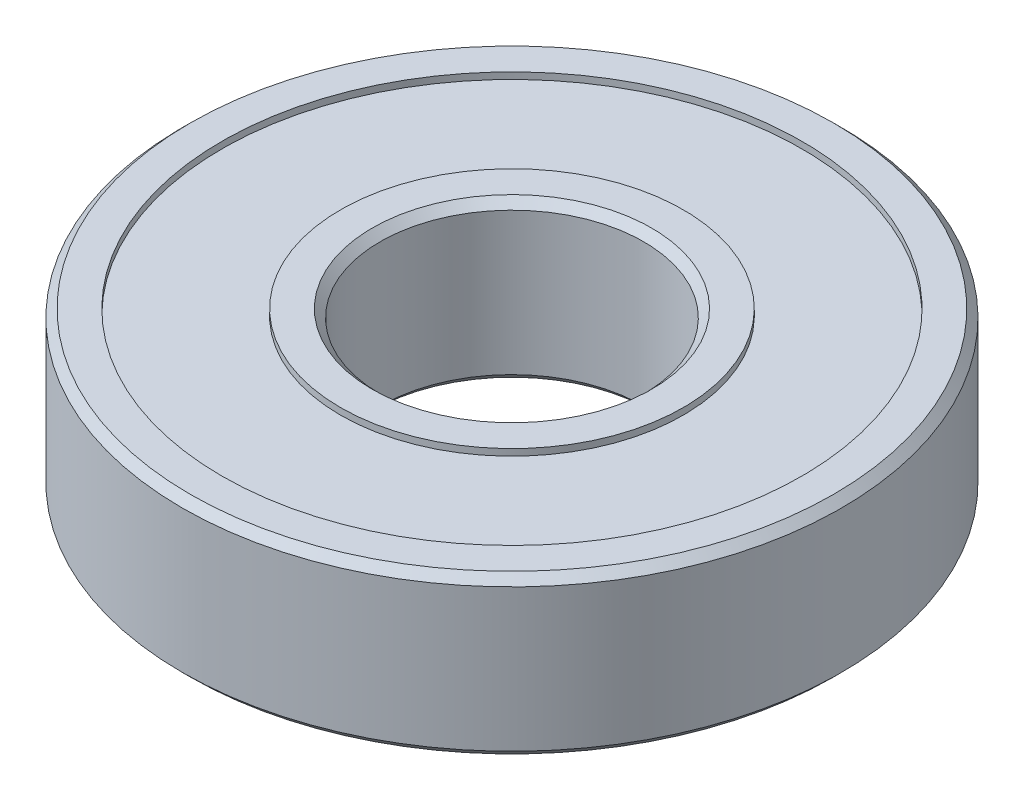
ISO-10303-21;
HEADER;
FILE_DESCRIPTION(('STEP AP214'),'2;1');
FILE_NAME('part.step','',(''),(''),'','','');
FILE_SCHEMA(('AUTOMOTIVE_DESIGN { 1 0 10303 214 1 1 1 1 }'));
ENDSEC;
DATA;
#1=APPLICATION_CONTEXT('core data for automotive mechanical design processes');
#2=APPLICATION_PROTOCOL_DEFINITION('international standard','automotive_design',2000,#1);
#3=PRODUCT_CONTEXT('',#1,'mechanical');
#4=PRODUCT('Part','Part','',(#3));
#5=PRODUCT_RELATED_PRODUCT_CATEGORY('part','',(#4));
#6=PRODUCT_DEFINITION_FORMATION('','',#4);
#7=PRODUCT_DEFINITION_CONTEXT('part definition',#1,'design');
#8=PRODUCT_DEFINITION('design','',#6,#7);
#9=PRODUCT_DEFINITION_SHAPE('','',#8);
#10=(LENGTH_UNIT() NAMED_UNIT(*) SI_UNIT(.MILLI.,.METRE.));
#11=(NAMED_UNIT(*) PLANE_ANGLE_UNIT() SI_UNIT($,.RADIAN.));
#12=(NAMED_UNIT(*) SI_UNIT($,.STERADIAN.) SOLID_ANGLE_UNIT());
#13=UNCERTAINTY_MEASURE_WITH_UNIT(LENGTH_MEASURE(1.E-05),#10,'distance_accuracy_value','');
#14=(GEOMETRIC_REPRESENTATION_CONTEXT(3) GLOBAL_UNCERTAINTY_ASSIGNED_CONTEXT((#13)) GLOBAL_UNIT_ASSIGNED_CONTEXT((#10,
#11,#12)) REPRESENTATION_CONTEXT('',''));
#15=CARTESIAN_POINT('',(0.,0.,0.));
#16=DIRECTION('',(0.,0.,1.));
#17=DIRECTION('',(1.,0.,0.));
#18=AXIS2_PLACEMENT_3D('',#15,#16,#17);
#19=CARTESIAN_POINT('',(0.,2.75,0.));
#20=DIRECTION('',(0.,1.,0.));
#21=DIRECTION('',(0.,0.,1.));
#22=AXIS2_PLACEMENT_3D('',#19,#20,#21);
#23=PLANE('',#22);
#24=CARTESIAN_POINT('',(0.,2.75,0.));
#25=DIRECTION('',(0.,1.,0.));
#26=DIRECTION('',(0.,0.,1.));
#27=AXIS2_PLACEMENT_3D('',#24,#25,#26);
#28=CIRCLE('',#27,6.5);
#29=CARTESIAN_POINT('',(0.,2.75,6.5));
#30=VERTEX_POINT('',#29);
#31=EDGE_CURVE('E82',#30,#30,#28,.T.);
#32=ORIENTED_EDGE('',*,*,#31,.F.);
#33=EDGE_LOOP('',(#32));
#34=FACE_BOUND('',#33,.T.);
#35=CARTESIAN_POINT('',(0.,2.75,0.));
#36=DIRECTION('',(0.,1.,0.));
#37=DIRECTION('',(0.,0.,1.));
#38=AXIS2_PLACEMENT_3D('',#35,#36,#37);
#39=CIRCLE('',#38,11.);
#40=CARTESIAN_POINT('',(0.,2.75,11.));
#41=VERTEX_POINT('',#40);
#42=EDGE_CURVE('E86',#41,#41,#39,.F.);
#43=ORIENTED_EDGE('',*,*,#42,.F.);
#44=EDGE_LOOP('',(#43));
#45=FACE_BOUND('',#44,.T.);
#46=ADVANCED_FACE('F49',(#34,#45),#23,.T.);
#47=CARTESIAN_POINT('',(0.,-2.75,0.));
#48=DIRECTION('',(0.,1.,0.));
#49=DIRECTION('',(0.,0.,1.));
#50=AXIS2_PLACEMENT_3D('',#47,#48,#49);
#51=PLANE('',#50);
#52=CARTESIAN_POINT('',(0.,-2.75,0.));
#53=DIRECTION('',(0.,1.,0.));
#54=DIRECTION('',(0.,0.,1.));
#55=AXIS2_PLACEMENT_3D('',#52,#53,#54);
#56=CIRCLE('',#55,6.5);
#57=CARTESIAN_POINT('',(0.,-2.75,6.5));
#58=VERTEX_POINT('',#57);
#59=EDGE_CURVE('E95',#58,#58,#56,.F.);
#60=ORIENTED_EDGE('',*,*,#59,.F.);
#61=EDGE_LOOP('',(#60));
#62=FACE_BOUND('',#61,.T.);
#63=CARTESIAN_POINT('',(0.,-2.75,0.));
#64=DIRECTION('',(0.,1.,0.));
#65=DIRECTION('',(0.,0.,1.));
#66=AXIS2_PLACEMENT_3D('',#63,#64,#65);
#67=CIRCLE('',#66,11.);
#68=CARTESIAN_POINT('',(0.,-2.75,11.));
#69=VERTEX_POINT('',#68);
#70=EDGE_CURVE('E83',#69,#69,#67,.T.);
#71=ORIENTED_EDGE('',*,*,#70,.F.);
#72=EDGE_LOOP('',(#71));
#73=FACE_BOUND('',#72,.T.);
#74=ADVANCED_FACE('F130',(#62,#73),#51,.F.);
#75=CARTESIAN_POINT('',(0.,3.,0.));
#76=DIRECTION('',(0.,-1.,0.));
#77=DIRECTION('',(0.,0.,-1.));
#78=AXIS2_PLACEMENT_3D('',#75,#76,#77);
#79=CYLINDRICAL_SURFACE('',#78,11.);
#80=CARTESIAN_POINT('',(0.,-3.,0.));
#81=DIRECTION('',(0.,1.,0.));
#82=DIRECTION('',(0.,0.,1.));
#83=AXIS2_PLACEMENT_3D('',#80,#81,#82);
#84=CIRCLE('',#83,11.);
#85=CARTESIAN_POINT('',(0.,-3.,11.));
#86=VERTEX_POINT('',#85);
#87=EDGE_CURVE('E92',#86,#86,#84,.T.);
#88=ORIENTED_EDGE('',*,*,#87,.F.);
#89=EDGE_LOOP('',(#88));
#90=FACE_BOUND('',#89,.T.);
#91=ORIENTED_EDGE('',*,*,#70,.T.);
#92=EDGE_LOOP('',(#91));
#93=FACE_BOUND('',#92,.T.);
#94=ADVANCED_FACE('F136',(#90,#93),#79,.F.);
#95=ORIENTED_EDGE('',*,*,#42,.T.);
#96=EDGE_LOOP('',(#95));
#97=FACE_BOUND('',#96,.T.);
#98=CARTESIAN_POINT('',(0.,3.,0.));
#99=DIRECTION('',(0.,1.,0.));
#100=DIRECTION('',(0.,0.,1.));
#101=AXIS2_PLACEMENT_3D('',#98,#99,#100);
#102=CIRCLE('',#101,11.);
#103=CARTESIAN_POINT('',(0.,3.,11.));
#104=VERTEX_POINT('',#103);
#105=EDGE_CURVE('E91',#104,#104,#102,.T.);
#106=ORIENTED_EDGE('',*,*,#105,.T.);
#107=EDGE_LOOP('',(#106));
#108=FACE_BOUND('',#107,.T.);
#109=ADVANCED_FACE('F142',(#97,#108),#79,.F.);
#110=CARTESIAN_POINT('',(0.,3.,0.));
#111=DIRECTION('',(0.,-1.,0.));
#112=DIRECTION('',(0.,0.,-1.));
#113=AXIS2_PLACEMENT_3D('',#110,#111,#112);
#114=CYLINDRICAL_SURFACE('',#113,12.5);
#115=CARTESIAN_POINT('',(0.,-2.70000000000001,0.));
#116=DIRECTION('',(0.,1.,0.));
#117=DIRECTION('',(0.,0.,1.));
#118=AXIS2_PLACEMENT_3D('',#115,#116,#117);
#119=CIRCLE('',#118,12.5);
#120=CARTESIAN_POINT('',(0.,-2.70000000000001,12.5));
#121=VERTEX_POINT('',#120);
#122=EDGE_CURVE('E61',#121,#121,#119,.T.);
#123=ORIENTED_EDGE('',*,*,#122,.T.);
#124=EDGE_LOOP('',(#123));
#125=FACE_BOUND('',#124,.T.);
#126=CARTESIAN_POINT('',(0.,2.70000000000001,0.));
#127=DIRECTION('',(0.,1.,0.));
#128=DIRECTION('',(0.,0.,1.));
#129=AXIS2_PLACEMENT_3D('',#126,#127,#128);
#130=CIRCLE('',#129,12.5);
#131=CARTESIAN_POINT('',(0.,2.70000000000001,12.5));
#132=VERTEX_POINT('',#131);
#133=EDGE_CURVE('E65',#132,#132,#130,.F.);
#134=ORIENTED_EDGE('',*,*,#133,.T.);
#135=EDGE_LOOP('',(#134));
#136=FACE_BOUND('',#135,.T.);
#137=ADVANCED_FACE('F171',(#125,#136),#114,.T.);
#138=CARTESIAN_POINT('',(0.,3.,0.));
#139=DIRECTION('',(0.,1.,0.));
#140=DIRECTION('',(0.,0.,1.));
#141=AXIS2_PLACEMENT_3D('',#138,#139,#140);
#142=PLANE('',#141);
#143=CARTESIAN_POINT('',(0.,3.,0.));
#144=DIRECTION('',(0.,1.,0.));
#145=DIRECTION('',(0.,0.,1.));
#146=AXIS2_PLACEMENT_3D('',#143,#144,#145);
#147=CIRCLE('',#146,12.2);
#148=CARTESIAN_POINT('',(0.,3.,12.2));
#149=VERTEX_POINT('',#148);
#150=EDGE_CURVE('E11',#149,#149,#147,.T.);
#151=ORIENTED_EDGE('',*,*,#150,.T.);
#152=EDGE_LOOP('',(#151));
#153=FACE_BOUND('',#152,.T.);
#154=ORIENTED_EDGE('',*,*,#105,.F.);
#155=EDGE_LOOP('',(#154));
#156=FACE_BOUND('',#155,.T.);
#157=ADVANCED_FACE('F173',(#153,#156),#142,.T.);
#158=CARTESIAN_POINT('',(0.,-3.,0.));
#159=DIRECTION('',(0.,1.,0.));
#160=DIRECTION('',(0.,0.,1.));
#161=AXIS2_PLACEMENT_3D('',#158,#159,#160);
#162=PLANE('',#161);
#163=CARTESIAN_POINT('',(0.,-3.,0.));
#164=DIRECTION('',(0.,1.,0.));
#165=DIRECTION('',(0.,0.,1.));
#166=AXIS2_PLACEMENT_3D('',#163,#164,#165);
#167=CIRCLE('',#166,12.2);
#168=CARTESIAN_POINT('',(0.,-3.,12.2));
#169=VERTEX_POINT('',#168);
#170=EDGE_CURVE('E57',#169,#169,#167,.F.);
#171=ORIENTED_EDGE('',*,*,#170,.T.);
#172=EDGE_LOOP('',(#171));
#173=FACE_BOUND('',#172,.T.);
#174=ORIENTED_EDGE('',*,*,#87,.T.);
#175=EDGE_LOOP('',(#174));
#176=FACE_BOUND('',#175,.T.);
#177=ADVANCED_FACE('F127',(#173,#176),#162,.F.);
#178=CARTESIAN_POINT('',(0.,3.,0.));
#179=DIRECTION('',(0.,-1.,0.));
#180=DIRECTION('',(0.,0.,-1.));
#181=AXIS2_PLACEMENT_3D('',#178,#179,#180);
#182=CYLINDRICAL_SURFACE('',#181,6.5);
#183=CARTESIAN_POINT('',(0.,-3.,0.));
#184=DIRECTION('',(0.,1.,0.));
#185=DIRECTION('',(0.,0.,1.));
#186=AXIS2_PLACEMENT_3D('',#183,#184,#185);
#187=CIRCLE('',#186,6.5);
#188=CARTESIAN_POINT('',(0.,-3.,6.5));
#189=VERTEX_POINT('',#188);
#190=EDGE_CURVE('E101',#189,#189,#187,.T.);
#191=ORIENTED_EDGE('',*,*,#190,.T.);
#192=EDGE_LOOP('',(#191));
#193=FACE_BOUND('',#192,.T.);
#194=ORIENTED_EDGE('',*,*,#59,.T.);
#195=EDGE_LOOP('',(#194));
#196=FACE_BOUND('',#195,.T.);
#197=ADVANCED_FACE('F114',(#193,#196),#182,.T.);
#198=CARTESIAN_POINT('',(0.,3.,0.));
#199=DIRECTION('',(0.,-1.,0.));
#200=DIRECTION('',(0.,0.,-1.));
#201=AXIS2_PLACEMENT_3D('',#198,#199,#200);
#202=CYLINDRICAL_SURFACE('',#201,5.);
#203=CARTESIAN_POINT('',(0.,-2.7,0.));
#204=DIRECTION('',(0.,1.,0.));
#205=DIRECTION('',(0.,0.,1.));
#206=AXIS2_PLACEMENT_3D('',#203,#204,#205);
#207=CIRCLE('',#206,5.);
#208=CARTESIAN_POINT('',(0.,-2.7,5.));
#209=VERTEX_POINT('',#208);
#210=EDGE_CURVE('E73',#209,#209,#207,.F.);
#211=ORIENTED_EDGE('',*,*,#210,.T.);
#212=EDGE_LOOP('',(#211));
#213=FACE_BOUND('',#212,.T.);
#214=CARTESIAN_POINT('',(0.,2.70000000000001,0.));
#215=DIRECTION('',(0.,1.,0.));
#216=DIRECTION('',(0.,0.,1.));
#217=AXIS2_PLACEMENT_3D('',#214,#215,#216);
#218=CIRCLE('',#217,5.);
#219=CARTESIAN_POINT('',(0.,2.70000000000001,5.));
#220=VERTEX_POINT('',#219);
#221=EDGE_CURVE('E76',#220,#220,#218,.T.);
#222=ORIENTED_EDGE('',*,*,#221,.T.);
#223=EDGE_LOOP('',(#222));
#224=FACE_BOUND('',#223,.T.);
#225=ADVANCED_FACE('F111',(#213,#224),#202,.F.);
#226=ORIENTED_EDGE('',*,*,#31,.T.);
#227=EDGE_LOOP('',(#226));
#228=FACE_BOUND('',#227,.T.);
#229=CARTESIAN_POINT('',(0.,3.,0.));
#230=DIRECTION('',(0.,1.,0.));
#231=DIRECTION('',(0.,0.,1.));
#232=AXIS2_PLACEMENT_3D('',#229,#230,#231);
#233=CIRCLE('',#232,6.5);
#234=CARTESIAN_POINT('',(0.,3.,6.5));
#235=VERTEX_POINT('',#234);
#236=EDGE_CURVE('E100',#235,#235,#233,.T.);
#237=ORIENTED_EDGE('',*,*,#236,.F.);
#238=EDGE_LOOP('',(#237));
#239=FACE_BOUND('',#238,.T.);
#240=ADVANCED_FACE('F109',(#228,#239),#182,.T.);
#241=CARTESIAN_POINT('',(0.,3.,0.));
#242=DIRECTION('',(0.,1.,0.));
#243=DIRECTION('',(0.,0.,1.));
#244=AXIS2_PLACEMENT_3D('',#241,#242,#243);
#245=PLANE('',#244);
#246=CARTESIAN_POINT('',(0.,3.,0.));
#247=DIRECTION('',(0.,1.,0.));
#248=DIRECTION('',(0.,0.,1.));
#249=AXIS2_PLACEMENT_3D('',#246,#247,#248);
#250=CIRCLE('',#249,5.3);
#251=CARTESIAN_POINT('',(0.,3.,5.3));
#252=VERTEX_POINT('',#251);
#253=EDGE_CURVE('E70',#252,#252,#250,.F.);
#254=ORIENTED_EDGE('',*,*,#253,.T.);
#255=EDGE_LOOP('',(#254));
#256=FACE_BOUND('',#255,.T.);
#257=ORIENTED_EDGE('',*,*,#236,.T.);
#258=EDGE_LOOP('',(#257));
#259=FACE_BOUND('',#258,.T.);
#260=ADVANCED_FACE('F107',(#256,#259),#245,.T.);
#261=CARTESIAN_POINT('',(0.,-3.,0.));
#262=DIRECTION('',(0.,1.,0.));
#263=DIRECTION('',(0.,0.,1.));
#264=AXIS2_PLACEMENT_3D('',#261,#262,#263);
#265=PLANE('',#264);
#266=CARTESIAN_POINT('',(0.,-3.,0.));
#267=DIRECTION('',(0.,1.,0.));
#268=DIRECTION('',(0.,0.,1.));
#269=AXIS2_PLACEMENT_3D('',#266,#267,#268);
#270=CIRCLE('',#269,5.29999999999999);
#271=CARTESIAN_POINT('',(0.,-3.,5.29999999999999));
#272=VERTEX_POINT('',#271);
#273=EDGE_CURVE('E79',#272,#272,#270,.T.);
#274=ORIENTED_EDGE('',*,*,#273,.T.);
#275=EDGE_LOOP('',(#274));
#276=FACE_BOUND('',#275,.T.);
#277=ORIENTED_EDGE('',*,*,#190,.F.);
#278=EDGE_LOOP('',(#277));
#279=FACE_BOUND('',#278,.T.);
#280=ADVANCED_FACE('F120',(#276,#279),#265,.F.);
#281=CARTESIAN_POINT('',(0.,-3.,0.));
#282=DIRECTION('',(0.,-1.,0.));
#283=DIRECTION('',(0.,0.,-1.));
#284=AXIS2_PLACEMENT_3D('',#281,#282,#283);
#285=CONICAL_SURFACE('',#284,5.29999999999999,0.785398163397444);
#286=ORIENTED_EDGE('',*,*,#210,.F.);
#287=EDGE_LOOP('',(#286));
#288=FACE_BOUND('',#287,.T.);
#289=ORIENTED_EDGE('',*,*,#273,.F.);
#290=EDGE_LOOP('',(#289));
#291=FACE_BOUND('',#290,.T.);
#292=ADVANCED_FACE('F146',(#288,#291),#285,.F.);
#293=CARTESIAN_POINT('',(0.,2.70000000000001,0.));
#294=DIRECTION('',(0.,1.,0.));
#295=DIRECTION('',(0.,0.,1.));
#296=AXIS2_PLACEMENT_3D('',#293,#294,#295);
#297=CONICAL_SURFACE('',#296,5.,0.785398163397453);
#298=ORIENTED_EDGE('',*,*,#253,.F.);
#299=EDGE_LOOP('',(#298));
#300=FACE_BOUND('',#299,.T.);
#301=ORIENTED_EDGE('',*,*,#221,.F.);
#302=EDGE_LOOP('',(#301));
#303=FACE_BOUND('',#302,.T.);
#304=ADVANCED_FACE('F152',(#300,#303),#297,.F.);
#305=CARTESIAN_POINT('',(0.,-2.70000000000001,0.));
#306=DIRECTION('',(0.,1.,0.));
#307=DIRECTION('',(0.,0.,1.));
#308=AXIS2_PLACEMENT_3D('',#305,#306,#307);
#309=CONICAL_SURFACE('',#308,12.5,0.785398163397448);
#310=ORIENTED_EDGE('',*,*,#170,.F.);
#311=EDGE_LOOP('',(#310));
#312=FACE_BOUND('',#311,.T.);
#313=ORIENTED_EDGE('',*,*,#122,.F.);
#314=EDGE_LOOP('',(#313));
#315=FACE_BOUND('',#314,.T.);
#316=ADVANCED_FACE('F158',(#312,#315),#309,.T.);
#317=CARTESIAN_POINT('',(0.,3.,0.));
#318=DIRECTION('',(0.,-1.,0.));
#319=DIRECTION('',(0.,0.,-1.));
#320=AXIS2_PLACEMENT_3D('',#317,#318,#319);
#321=CONICAL_SURFACE('',#320,12.2,0.785398163397451);
#322=ORIENTED_EDGE('',*,*,#133,.F.);
#323=EDGE_LOOP('',(#322));
#324=FACE_BOUND('',#323,.T.);
#325=ORIENTED_EDGE('',*,*,#150,.F.);
#326=EDGE_LOOP('',(#325));
#327=FACE_BOUND('',#326,.T.);
#328=ADVANCED_FACE('F52',(#324,#327),#321,.T.);
#329=CLOSED_SHELL('',(#46,#74,#94,#109,#137,#157,#177,#197,#225,#240,#260,#280,#292,#304,#316,#328));
#330=MANIFOLD_SOLID_BREP('B2',#329);
#331=ADVANCED_BREP_SHAPE_REPRESENTATION('',(#18,#330),#14);
#332=SHAPE_DEFINITION_REPRESENTATION(#9,#331);
ENDSEC;
END-ISO-10303-21;
